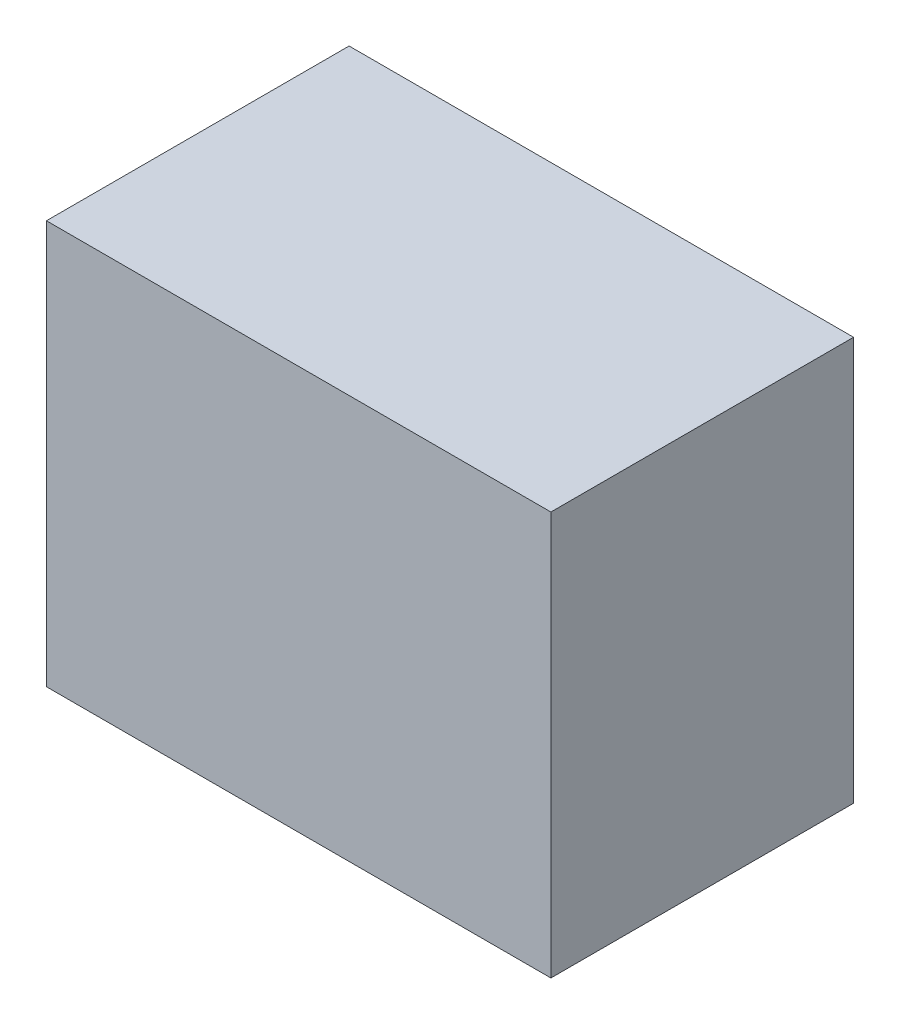
ISO-10303-21;
HEADER;
FILE_DESCRIPTION(('STEP AP214'),'2;1');
FILE_NAME('part.step','',(''),(''),'','','');
FILE_SCHEMA(('AUTOMOTIVE_DESIGN { 1 0 10303 214 1 1 1 1 }'));
ENDSEC;
DATA;
#1=APPLICATION_CONTEXT('core data for automotive mechanical design processes');
#2=APPLICATION_PROTOCOL_DEFINITION('international standard','automotive_design',2000,#1);
#3=PRODUCT_CONTEXT('',#1,'mechanical');
#4=PRODUCT('Part','Part','',(#3));
#5=PRODUCT_RELATED_PRODUCT_CATEGORY('part','',(#4));
#6=PRODUCT_DEFINITION_FORMATION('','',#4);
#7=PRODUCT_DEFINITION_CONTEXT('part definition',#1,'design');
#8=PRODUCT_DEFINITION('design','',#6,#7);
#9=PRODUCT_DEFINITION_SHAPE('','',#8);
#10=(LENGTH_UNIT() NAMED_UNIT(*) SI_UNIT(.MILLI.,.METRE.));
#11=(NAMED_UNIT(*) PLANE_ANGLE_UNIT() SI_UNIT($,.RADIAN.));
#12=(NAMED_UNIT(*) SI_UNIT($,.STERADIAN.) SOLID_ANGLE_UNIT());
#13=UNCERTAINTY_MEASURE_WITH_UNIT(LENGTH_MEASURE(1.E-05),#10,'distance_accuracy_value','');
#14=(GEOMETRIC_REPRESENTATION_CONTEXT(3) GLOBAL_UNCERTAINTY_ASSIGNED_CONTEXT((#13)) GLOBAL_UNIT_ASSIGNED_CONTEXT((#10,
#11,#12)) REPRESENTATION_CONTEXT('',''));
#15=CARTESIAN_POINT('',(0.,0.,0.));
#16=DIRECTION('',(0.,0.,1.));
#17=DIRECTION('',(1.,0.,0.));
#18=AXIS2_PLACEMENT_3D('',#15,#16,#17);
#19=CARTESIAN_POINT('',(-4.37970210090716,3.02631469045025,30.));
#20=DIRECTION('',(1.,0.,0.));
#21=DIRECTION('',(0.,1.,0.));
#22=AXIS2_PLACEMENT_3D('',#19,#20,#21);
#23=PLANE('',#22);
#24=DIRECTION('',(0.,-1.,0.));
#25=VECTOR('',#24,1.);
#26=CARTESIAN_POINT('',(-4.37970210090716,3.02631469045025,0.));
#27=LINE('',#26,#25);
#28=CARTESIAN_POINT('',(-4.37970210090716,3.02631469045025,0.));
#29=VERTEX_POINT('',#28);
#30=CARTESIAN_POINT('',(-4.37970210090716,-36.9736853095498,0.));
#31=VERTEX_POINT('',#30);
#32=EDGE_CURVE('E96',#29,#31,#27,.T.);
#33=ORIENTED_EDGE('',*,*,#32,.T.);
#34=DIRECTION('',(0.,0.,-1.));
#35=VECTOR('',#34,1.);
#36=CARTESIAN_POINT('',(-4.37970210090716,-36.9736853095498,30.));
#37=LINE('',#36,#35);
#38=CARTESIAN_POINT('',(-4.37970210090716,-36.9736853095498,30.));
#39=VERTEX_POINT('',#38);
#40=EDGE_CURVE('E11',#39,#31,#37,.T.);
#41=ORIENTED_EDGE('',*,*,#40,.F.);
#42=DIRECTION('',(0.,-1.,0.));
#43=VECTOR('',#42,1.);
#44=CARTESIAN_POINT('',(-4.37970210090716,3.02631469045025,30.));
#45=LINE('',#44,#43);
#46=CARTESIAN_POINT('',(-4.37970210090716,3.02631469045025,30.));
#47=VERTEX_POINT('',#46);
#48=EDGE_CURVE('E84',#47,#39,#45,.T.);
#49=ORIENTED_EDGE('',*,*,#48,.F.);
#50=DIRECTION('',(0.,0.,-1.));
#51=VECTOR('',#50,1.);
#52=CARTESIAN_POINT('',(-4.37970210090716,3.02631469045025,30.));
#53=LINE('',#52,#51);
#54=EDGE_CURVE('E92',#47,#29,#53,.T.);
#55=ORIENTED_EDGE('',*,*,#54,.T.);
#56=EDGE_LOOP('',(#33,#41,#49,#55));
#57=FACE_BOUND('',#56,.T.);
#58=ADVANCED_FACE('F33',(#57),#23,.F.);
#59=CARTESIAN_POINT('',(-4.37970210090716,-36.9736853095498,30.));
#60=DIRECTION('',(0.,1.,0.));
#61=DIRECTION('',(0.,0.,1.));
#62=AXIS2_PLACEMENT_3D('',#59,#60,#61);
#63=PLANE('',#62);
#64=DIRECTION('',(1.,0.,0.));
#65=VECTOR('',#64,1.);
#66=CARTESIAN_POINT('',(-4.37970210090716,-36.9736853095498,0.));
#67=LINE('',#66,#65);
#68=CARTESIAN_POINT('',(45.6202978990928,-36.9736853095498,0.));
#69=VERTEX_POINT('',#68);
#70=EDGE_CURVE('E88',#31,#69,#67,.T.);
#71=ORIENTED_EDGE('',*,*,#70,.T.);
#72=DIRECTION('',(0.,0.,-1.));
#73=VECTOR('',#72,1.);
#74=CARTESIAN_POINT('',(45.6202978990928,-36.9736853095498,30.));
#75=LINE('',#74,#73);
#76=CARTESIAN_POINT('',(45.6202978990928,-36.9736853095498,30.));
#77=VERTEX_POINT('',#76);
#78=EDGE_CURVE('E41',#77,#69,#75,.T.);
#79=ORIENTED_EDGE('',*,*,#78,.F.);
#80=DIRECTION('',(1.,0.,0.));
#81=VECTOR('',#80,1.);
#82=CARTESIAN_POINT('',(-4.37970210090716,-36.9736853095498,30.));
#83=LINE('',#82,#81);
#84=EDGE_CURVE('E79',#39,#77,#83,.T.);
#85=ORIENTED_EDGE('',*,*,#84,.F.);
#86=ORIENTED_EDGE('',*,*,#40,.T.);
#87=EDGE_LOOP('',(#71,#79,#85,#86));
#88=FACE_BOUND('',#87,.T.);
#89=ADVANCED_FACE('F87',(#88),#63,.F.);
#90=CARTESIAN_POINT('',(45.6202978990928,3.02631469045025,30.));
#91=DIRECTION('',(-1.,0.,0.));
#92=DIRECTION('',(0.,-1.,0.));
#93=AXIS2_PLACEMENT_3D('',#90,#91,#92);
#94=PLANE('',#93);
#95=DIRECTION('',(0.,1.,0.));
#96=VECTOR('',#95,1.);
#97=CARTESIAN_POINT('',(45.6202978990928,3.02631469045025,0.));
#98=LINE('',#97,#96);
#99=CARTESIAN_POINT('',(45.6202978990928,3.02631469045025,0.));
#100=VERTEX_POINT('',#99);
#101=EDGE_CURVE('E66',#69,#100,#98,.T.);
#102=ORIENTED_EDGE('',*,*,#101,.T.);
#103=DIRECTION('',(0.,0.,-1.));
#104=VECTOR('',#103,1.);
#105=CARTESIAN_POINT('',(45.6202978990928,3.02631469045025,30.));
#106=LINE('',#105,#104);
#107=CARTESIAN_POINT('',(45.6202978990928,3.02631469045025,30.));
#108=VERTEX_POINT('',#107);
#109=EDGE_CURVE('E89',#108,#100,#106,.T.);
#110=ORIENTED_EDGE('',*,*,#109,.F.);
#111=DIRECTION('',(0.,1.,0.));
#112=VECTOR('',#111,1.);
#113=CARTESIAN_POINT('',(45.6202978990928,3.02631469045025,30.));
#114=LINE('',#113,#112);
#115=EDGE_CURVE('E82',#77,#108,#114,.T.);
#116=ORIENTED_EDGE('',*,*,#115,.F.);
#117=ORIENTED_EDGE('',*,*,#78,.T.);
#118=EDGE_LOOP('',(#102,#110,#116,#117));
#119=FACE_BOUND('',#118,.T.);
#120=ADVANCED_FACE('F90',(#119),#94,.F.);
#121=CARTESIAN_POINT('',(-4.37970210090716,3.02631469045025,30.));
#122=DIRECTION('',(0.,-1.,0.));
#123=DIRECTION('',(0.,0.,-1.));
#124=AXIS2_PLACEMENT_3D('',#121,#122,#123);
#125=PLANE('',#124);
#126=DIRECTION('',(-1.,0.,0.));
#127=VECTOR('',#126,1.);
#128=CARTESIAN_POINT('',(-4.37970210090716,3.02631469045025,0.));
#129=LINE('',#128,#127);
#130=EDGE_CURVE('E72',#100,#29,#129,.T.);
#131=ORIENTED_EDGE('',*,*,#130,.T.);
#132=ORIENTED_EDGE('',*,*,#54,.F.);
#133=DIRECTION('',(-1.,0.,0.));
#134=VECTOR('',#133,1.);
#135=CARTESIAN_POINT('',(-4.37970210090716,3.02631469045025,30.));
#136=LINE('',#135,#134);
#137=EDGE_CURVE('E49',#108,#47,#136,.T.);
#138=ORIENTED_EDGE('',*,*,#137,.F.);
#139=ORIENTED_EDGE('',*,*,#109,.T.);
#140=EDGE_LOOP('',(#131,#132,#138,#139));
#141=FACE_BOUND('',#140,.T.);
#142=ADVANCED_FACE('F103',(#141),#125,.F.);
#143=CARTESIAN_POINT('',(0.,0.,30.));
#144=DIRECTION('',(0.,0.,1.));
#145=DIRECTION('',(1.,0.,0.));
#146=AXIS2_PLACEMENT_3D('',#143,#144,#145);
#147=PLANE('',#146);
#148=ORIENTED_EDGE('',*,*,#48,.T.);
#149=ORIENTED_EDGE('',*,*,#84,.T.);
#150=ORIENTED_EDGE('',*,*,#115,.T.);
#151=ORIENTED_EDGE('',*,*,#137,.T.);
#152=EDGE_LOOP('',(#148,#149,#150,#151));
#153=FACE_BOUND('',#152,.T.);
#154=ADVANCED_FACE('F80',(#153),#147,.T.);
#155=CARTESIAN_POINT('',(0.,0.,0.));
#156=DIRECTION('',(0.,0.,1.));
#157=DIRECTION('',(1.,0.,0.));
#158=AXIS2_PLACEMENT_3D('',#155,#156,#157);
#159=PLANE('',#158);
#160=ORIENTED_EDGE('',*,*,#32,.F.);
#161=ORIENTED_EDGE('',*,*,#130,.F.);
#162=ORIENTED_EDGE('',*,*,#101,.F.);
#163=ORIENTED_EDGE('',*,*,#70,.F.);
#164=EDGE_LOOP('',(#160,#161,#162,#163));
#165=FACE_BOUND('',#164,.T.);
#166=ADVANCED_FACE('F106',(#165),#159,.F.);
#167=CLOSED_SHELL('',(#58,#89,#120,#142,#154,#166));
#168=MANIFOLD_SOLID_BREP('B2',#167);
#169=ADVANCED_BREP_SHAPE_REPRESENTATION('',(#18,#168),#14);
#170=SHAPE_DEFINITION_REPRESENTATION(#9,#169);
ENDSEC;
END-ISO-10303-21;
